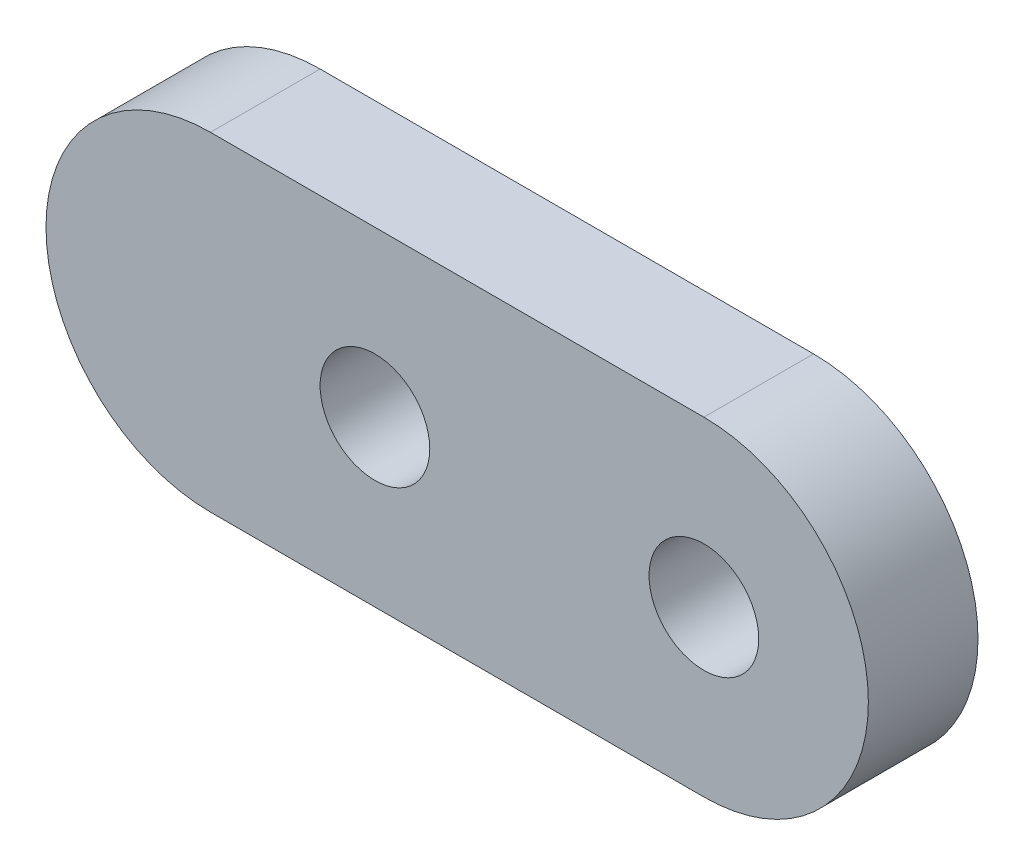
ISO-10303-21;
HEADER;
FILE_DESCRIPTION(('STEP AP214'),'2;1');
FILE_NAME('part.step','',(''),(''),'','','');
FILE_SCHEMA(('AUTOMOTIVE_DESIGN { 1 0 10303 214 1 1 1 1 }'));
ENDSEC;
DATA;
#1=APPLICATION_CONTEXT('core data for automotive mechanical design processes');
#2=APPLICATION_PROTOCOL_DEFINITION('international standard','automotive_design',2000,#1);
#3=PRODUCT_CONTEXT('',#1,'mechanical');
#4=PRODUCT('Part','Part','',(#3));
#5=PRODUCT_RELATED_PRODUCT_CATEGORY('part','',(#4));
#6=PRODUCT_DEFINITION_FORMATION('','',#4);
#7=PRODUCT_DEFINITION_CONTEXT('part definition',#1,'design');
#8=PRODUCT_DEFINITION('design','',#6,#7);
#9=PRODUCT_DEFINITION_SHAPE('','',#8);
#10=(LENGTH_UNIT() NAMED_UNIT(*) SI_UNIT(.MILLI.,.METRE.));
#11=(NAMED_UNIT(*) PLANE_ANGLE_UNIT() SI_UNIT($,.RADIAN.));
#12=(NAMED_UNIT(*) SI_UNIT($,.STERADIAN.) SOLID_ANGLE_UNIT());
#13=UNCERTAINTY_MEASURE_WITH_UNIT(LENGTH_MEASURE(1.E-05),#10,'distance_accuracy_value','');
#14=(GEOMETRIC_REPRESENTATION_CONTEXT(3) GLOBAL_UNCERTAINTY_ASSIGNED_CONTEXT((#13)) GLOBAL_UNIT_ASSIGNED_CONTEXT((#10,
#11,#12)) REPRESENTATION_CONTEXT('',''));
#15=CARTESIAN_POINT('',(0.,0.,0.));
#16=DIRECTION('',(0.,0.,1.));
#17=DIRECTION('',(1.,0.,0.));
#18=AXIS2_PLACEMENT_3D('',#15,#16,#17);
#19=CARTESIAN_POINT('',(-1487.887905202,374.0382496401,3.));
#20=DIRECTION('',(0.,0.,1.));
#21=DIRECTION('',(1.,0.,0.));
#22=AXIS2_PLACEMENT_3D('',#19,#20,#21);
#23=PLANE('',#22);
#24=CARTESIAN_POINT('',(-1487.887905202,374.0382496401,3.));
#25=DIRECTION('',(0.,0.,1.));
#26=DIRECTION('',(1.,0.,0.));
#27=AXIS2_PLACEMENT_3D('',#24,#25,#26);
#28=CIRCLE('',#27,1.50000000000006);
#29=CARTESIAN_POINT('',(-1486.387905202,374.0382496401,3.));
#30=VERTEX_POINT('',#29);
#31=EDGE_CURVE('E100',#30,#30,#28,.T.);
#32=ORIENTED_EDGE('',*,*,#31,.F.);
#33=EDGE_LOOP('',(#32));
#34=FACE_BOUND('',#33,.T.);
#35=CARTESIAN_POINT('',(-1487.887905202,374.0382496401,3.));
#36=DIRECTION('',(0.,0.,1.));
#37=DIRECTION('',(1.,0.,0.));
#38=AXIS2_PLACEMENT_3D('',#35,#36,#37);
#39=CIRCLE('',#38,4.5);
#40=CARTESIAN_POINT('',(-1487.887905202,369.5382496401,3.));
#41=VERTEX_POINT('',#40);
#42=CARTESIAN_POINT('',(-1487.887905202,378.5382496401,3.));
#43=VERTEX_POINT('',#42);
#44=EDGE_CURVE('E85',#41,#43,#39,.T.);
#45=ORIENTED_EDGE('',*,*,#44,.T.);
#46=DIRECTION('',(-1.,0.,0.));
#47=VECTOR('',#46,1.);
#48=CARTESIAN_POINT('',(-1487.887905202,378.5382496401,3.));
#49=LINE('',#48,#47);
#50=CARTESIAN_POINT('',(-1501.387905202,378.5382496401,3.));
#51=VERTEX_POINT('',#50);
#52=EDGE_CURVE('E80',#43,#51,#49,.T.);
#53=ORIENTED_EDGE('',*,*,#52,.T.);
#54=CARTESIAN_POINT('',(-1501.387905202,374.0382496401,3.));
#55=DIRECTION('',(0.,0.,1.));
#56=DIRECTION('',(1.,0.,0.));
#57=AXIS2_PLACEMENT_3D('',#54,#55,#56);
#58=CIRCLE('',#57,4.5);
#59=CARTESIAN_POINT('',(-1501.387905202,369.5382496401,3.));
#60=VERTEX_POINT('',#59);
#61=EDGE_CURVE('E83',#51,#60,#58,.T.);
#62=ORIENTED_EDGE('',*,*,#61,.T.);
#63=DIRECTION('',(1.,0.,0.));
#64=VECTOR('',#63,1.);
#65=CARTESIAN_POINT('',(-1487.887905202,369.5382496401,3.));
#66=LINE('',#65,#64);
#67=EDGE_CURVE('E50',#60,#41,#66,.T.);
#68=ORIENTED_EDGE('',*,*,#67,.T.);
#69=EDGE_LOOP('',(#45,#53,#62,#68));
#70=FACE_BOUND('',#69,.T.);
#71=CARTESIAN_POINT('',(-1496.887905202,374.0382496401,3.));
#72=DIRECTION('',(0.,0.,1.));
#73=DIRECTION('',(1.,0.,0.));
#74=AXIS2_PLACEMENT_3D('',#71,#72,#73);
#75=CIRCLE('',#74,1.50000000000006);
#76=CARTESIAN_POINT('',(-1495.387905202,374.0382496401,3.));
#77=VERTEX_POINT('',#76);
#78=EDGE_CURVE('E115',#77,#77,#75,.T.);
#79=ORIENTED_EDGE('',*,*,#78,.F.);
#80=EDGE_LOOP('',(#79));
#81=FACE_BOUND('',#80,.T.);
#82=ADVANCED_FACE('F33',(#34,#70,#81),#23,.T.);
#83=CARTESIAN_POINT('',(-1487.887905202,374.0382496401,0.));
#84=DIRECTION('',(0.,0.,1.));
#85=DIRECTION('',(1.,0.,0.));
#86=AXIS2_PLACEMENT_3D('',#83,#84,#85);
#87=PLANE('',#86);
#88=CARTESIAN_POINT('',(-1487.887905202,374.0382496401,0.));
#89=DIRECTION('',(0.,0.,1.));
#90=DIRECTION('',(1.,0.,0.));
#91=AXIS2_PLACEMENT_3D('',#88,#89,#90);
#92=CIRCLE('',#91,1.50000000000006);
#93=CARTESIAN_POINT('',(-1486.387905202,374.0382496401,0.));
#94=VERTEX_POINT('',#93);
#95=EDGE_CURVE('E112',#94,#94,#92,.T.);
#96=ORIENTED_EDGE('',*,*,#95,.T.);
#97=EDGE_LOOP('',(#96));
#98=FACE_BOUND('',#97,.T.);
#99=CARTESIAN_POINT('',(-1487.887905202,374.0382496401,0.));
#100=DIRECTION('',(0.,0.,1.));
#101=DIRECTION('',(1.,0.,0.));
#102=AXIS2_PLACEMENT_3D('',#99,#100,#101);
#103=CIRCLE('',#102,4.5);
#104=CARTESIAN_POINT('',(-1487.887905202,369.5382496401,0.));
#105=VERTEX_POINT('',#104);
#106=CARTESIAN_POINT('',(-1487.887905202,378.5382496401,0.));
#107=VERTEX_POINT('',#106);
#108=EDGE_CURVE('E97',#105,#107,#103,.T.);
#109=ORIENTED_EDGE('',*,*,#108,.F.);
#110=DIRECTION('',(1.,0.,0.));
#111=VECTOR('',#110,1.);
#112=CARTESIAN_POINT('',(-1487.887905202,369.5382496401,0.));
#113=LINE('',#112,#111);
#114=CARTESIAN_POINT('',(-1501.387905202,369.5382496401,0.));
#115=VERTEX_POINT('',#114);
#116=EDGE_CURVE('E73',#115,#105,#113,.T.);
#117=ORIENTED_EDGE('',*,*,#116,.F.);
#118=CARTESIAN_POINT('',(-1501.387905202,374.0382496401,0.));
#119=DIRECTION('',(0.,0.,1.));
#120=DIRECTION('',(1.,0.,0.));
#121=AXIS2_PLACEMENT_3D('',#118,#119,#120);
#122=CIRCLE('',#121,4.5);
#123=CARTESIAN_POINT('',(-1501.387905202,378.5382496401,0.));
#124=VERTEX_POINT('',#123);
#125=EDGE_CURVE('E67',#124,#115,#122,.T.);
#126=ORIENTED_EDGE('',*,*,#125,.F.);
#127=DIRECTION('',(-1.,0.,0.));
#128=VECTOR('',#127,1.);
#129=CARTESIAN_POINT('',(-1487.887905202,378.5382496401,0.));
#130=LINE('',#129,#128);
#131=EDGE_CURVE('E89',#107,#124,#130,.T.);
#132=ORIENTED_EDGE('',*,*,#131,.F.);
#133=EDGE_LOOP('',(#109,#117,#126,#132));
#134=FACE_BOUND('',#133,.T.);
#135=CARTESIAN_POINT('',(-1496.887905202,374.0382496401,0.));
#136=DIRECTION('',(0.,0.,1.));
#137=DIRECTION('',(1.,0.,0.));
#138=AXIS2_PLACEMENT_3D('',#135,#136,#137);
#139=CIRCLE('',#138,1.50000000000006);
#140=CARTESIAN_POINT('',(-1495.387905202,374.0382496401,0.));
#141=VERTEX_POINT('',#140);
#142=EDGE_CURVE('E118',#141,#141,#139,.T.);
#143=ORIENTED_EDGE('',*,*,#142,.T.);
#144=EDGE_LOOP('',(#143));
#145=FACE_BOUND('',#144,.T.);
#146=ADVANCED_FACE('F108',(#98,#134,#145),#87,.F.);
#147=CARTESIAN_POINT('',(-1487.887905202,374.0382496401,3.));
#148=DIRECTION('',(0.,0.,-1.));
#149=DIRECTION('',(-1.,0.,0.));
#150=AXIS2_PLACEMENT_3D('',#147,#148,#149);
#151=CYLINDRICAL_SURFACE('',#150,4.5);
#152=ORIENTED_EDGE('',*,*,#108,.T.);
#153=DIRECTION('',(0.,0.,-1.));
#154=VECTOR('',#153,1.);
#155=CARTESIAN_POINT('',(-1487.887905202,378.5382496401,3.));
#156=LINE('',#155,#154);
#157=EDGE_CURVE('E11',#43,#107,#156,.T.);
#158=ORIENTED_EDGE('',*,*,#157,.F.);
#159=ORIENTED_EDGE('',*,*,#44,.F.);
#160=DIRECTION('',(0.,0.,-1.));
#161=VECTOR('',#160,1.);
#162=CARTESIAN_POINT('',(-1487.887905202,369.5382496401,3.));
#163=LINE('',#162,#161);
#164=EDGE_CURVE('E93',#41,#105,#163,.T.);
#165=ORIENTED_EDGE('',*,*,#164,.T.);
#166=EDGE_LOOP('',(#152,#158,#159,#165));
#167=FACE_BOUND('',#166,.T.);
#168=ADVANCED_FACE('F35',(#167),#151,.T.);
#169=CARTESIAN_POINT('',(-1487.887905202,378.5382496401,3.));
#170=DIRECTION('',(0.,-1.,0.));
#171=DIRECTION('',(0.,0.,-1.));
#172=AXIS2_PLACEMENT_3D('',#169,#170,#171);
#173=PLANE('',#172);
#174=ORIENTED_EDGE('',*,*,#131,.T.);
#175=DIRECTION('',(0.,0.,-1.));
#176=VECTOR('',#175,1.);
#177=CARTESIAN_POINT('',(-1501.387905202,378.5382496401,3.));
#178=LINE('',#177,#176);
#179=EDGE_CURVE('E42',#51,#124,#178,.T.);
#180=ORIENTED_EDGE('',*,*,#179,.F.);
#181=ORIENTED_EDGE('',*,*,#52,.F.);
#182=ORIENTED_EDGE('',*,*,#157,.T.);
#183=EDGE_LOOP('',(#174,#180,#181,#182));
#184=FACE_BOUND('',#183,.T.);
#185=ADVANCED_FACE('F88',(#184),#173,.F.);
#186=CARTESIAN_POINT('',(-1501.387905202,374.0382496401,3.));
#187=DIRECTION('',(0.,0.,-1.));
#188=DIRECTION('',(-1.,0.,0.));
#189=AXIS2_PLACEMENT_3D('',#186,#187,#188);
#190=CYLINDRICAL_SURFACE('',#189,4.5);
#191=ORIENTED_EDGE('',*,*,#125,.T.);
#192=DIRECTION('',(0.,0.,-1.));
#193=VECTOR('',#192,1.);
#194=CARTESIAN_POINT('',(-1501.387905202,369.5382496401,3.));
#195=LINE('',#194,#193);
#196=EDGE_CURVE('E90',#60,#115,#195,.T.);
#197=ORIENTED_EDGE('',*,*,#196,.F.);
#198=ORIENTED_EDGE('',*,*,#61,.F.);
#199=ORIENTED_EDGE('',*,*,#179,.T.);
#200=EDGE_LOOP('',(#191,#197,#198,#199));
#201=FACE_BOUND('',#200,.T.);
#202=ADVANCED_FACE('F91',(#201),#190,.T.);
#203=CARTESIAN_POINT('',(-1487.887905202,369.5382496401,3.));
#204=DIRECTION('',(0.,1.,0.));
#205=DIRECTION('',(0.,0.,1.));
#206=AXIS2_PLACEMENT_3D('',#203,#204,#205);
#207=PLANE('',#206);
#208=ORIENTED_EDGE('',*,*,#116,.T.);
#209=ORIENTED_EDGE('',*,*,#164,.F.);
#210=ORIENTED_EDGE('',*,*,#67,.F.);
#211=ORIENTED_EDGE('',*,*,#196,.T.);
#212=EDGE_LOOP('',(#208,#209,#210,#211));
#213=FACE_BOUND('',#212,.T.);
#214=ADVANCED_FACE('F105',(#213),#207,.F.);
#215=CARTESIAN_POINT('',(-1487.887905202,374.0382496401,3.));
#216=DIRECTION('',(0.,0.,-1.));
#217=DIRECTION('',(-1.,0.,0.));
#218=AXIS2_PLACEMENT_3D('',#215,#216,#217);
#219=CYLINDRICAL_SURFACE('',#218,1.50000000000006);
#220=ORIENTED_EDGE('',*,*,#31,.T.);
#221=EDGE_LOOP('',(#220));
#222=FACE_BOUND('',#221,.T.);
#223=ORIENTED_EDGE('',*,*,#95,.F.);
#224=EDGE_LOOP('',(#223));
#225=FACE_BOUND('',#224,.T.);
#226=ADVANCED_FACE('F136',(#222,#225),#219,.F.);
#227=CARTESIAN_POINT('',(-1496.887905202,374.0382496401,3.));
#228=DIRECTION('',(0.,0.,-1.));
#229=DIRECTION('',(-1.,0.,0.));
#230=AXIS2_PLACEMENT_3D('',#227,#228,#229);
#231=CYLINDRICAL_SURFACE('',#230,1.50000000000006);
#232=ORIENTED_EDGE('',*,*,#78,.T.);
#233=EDGE_LOOP('',(#232));
#234=FACE_BOUND('',#233,.T.);
#235=ORIENTED_EDGE('',*,*,#142,.F.);
#236=EDGE_LOOP('',(#235));
#237=FACE_BOUND('',#236,.T.);
#238=ADVANCED_FACE('F124',(#234,#237),#231,.F.);
#239=CLOSED_SHELL('',(#82,#146,#168,#185,#202,#214,#226,#238));
#240=MANIFOLD_SOLID_BREP('B2',#239);
#241=ADVANCED_BREP_SHAPE_REPRESENTATION('',(#18,#240),#14);
#242=SHAPE_DEFINITION_REPRESENTATION(#9,#241);
ENDSEC;
END-ISO-10303-21;
